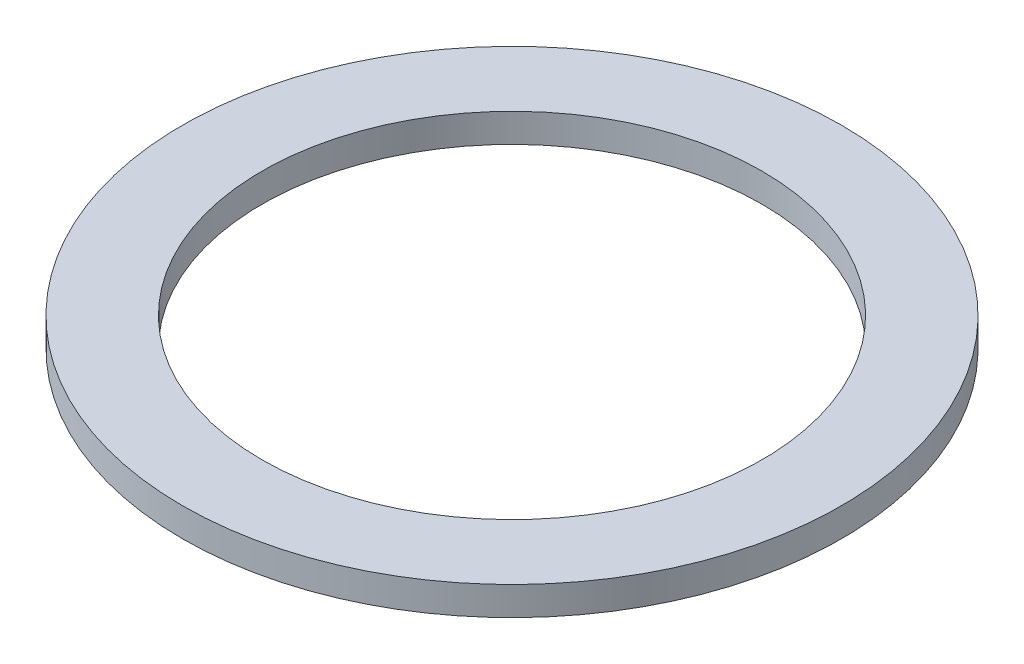
ISO-10303-21;
HEADER;
FILE_DESCRIPTION(('STEP AP214'),'2;1');
FILE_NAME('part.step','',(''),(''),'','','');
FILE_SCHEMA(('AUTOMOTIVE_DESIGN { 1 0 10303 214 1 1 1 1 }'));
ENDSEC;
DATA;
#1=APPLICATION_CONTEXT('core data for automotive mechanical design processes');
#2=APPLICATION_PROTOCOL_DEFINITION('international standard','automotive_design',2000,#1);
#3=PRODUCT_CONTEXT('',#1,'mechanical');
#4=PRODUCT('Part','Part','',(#3));
#5=PRODUCT_RELATED_PRODUCT_CATEGORY('part','',(#4));
#6=PRODUCT_DEFINITION_FORMATION('','',#4);
#7=PRODUCT_DEFINITION_CONTEXT('part definition',#1,'design');
#8=PRODUCT_DEFINITION('design','',#6,#7);
#9=PRODUCT_DEFINITION_SHAPE('','',#8);
#10=(LENGTH_UNIT() NAMED_UNIT(*) SI_UNIT(.MILLI.,.METRE.));
#11=(NAMED_UNIT(*) PLANE_ANGLE_UNIT() SI_UNIT($,.RADIAN.));
#12=(NAMED_UNIT(*) SI_UNIT($,.STERADIAN.) SOLID_ANGLE_UNIT());
#13=UNCERTAINTY_MEASURE_WITH_UNIT(LENGTH_MEASURE(1.E-05),#10,'distance_accuracy_value','');
#14=(GEOMETRIC_REPRESENTATION_CONTEXT(3) GLOBAL_UNCERTAINTY_ASSIGNED_CONTEXT((#13)) GLOBAL_UNIT_ASSIGNED_CONTEXT((#10,
#11,#12)) REPRESENTATION_CONTEXT('',''));
#15=CARTESIAN_POINT('',(0.,0.,0.));
#16=DIRECTION('',(0.,0.,1.));
#17=DIRECTION('',(1.,0.,0.));
#18=AXIS2_PLACEMENT_3D('',#15,#16,#17);
#19=CARTESIAN_POINT('',(0.,2.1,0.));
#20=DIRECTION('',(0.,1.,0.));
#21=DIRECTION('',(0.,0.,1.));
#22=AXIS2_PLACEMENT_3D('',#19,#20,#21);
#23=PLANE('',#22);
#24=CARTESIAN_POINT('',(0.,2.1,0.));
#25=DIRECTION('',(0.,1.,0.));
#26=DIRECTION('',(0.,0.,1.));
#27=AXIS2_PLACEMENT_3D('',#24,#25,#26);
#28=CIRCLE('',#27,24.12);
#29=CARTESIAN_POINT('',(0.,2.1,24.12));
#30=VERTEX_POINT('',#29);
#31=EDGE_CURVE('E10',#30,#30,#28,.T.);
#32=ORIENTED_EDGE('',*,*,#31,.T.);
#33=EDGE_LOOP('',(#32));
#34=FACE_BOUND('',#33,.T.);
#35=CARTESIAN_POINT('',(0.,2.1,0.));
#36=DIRECTION('',(0.,1.,0.));
#37=DIRECTION('',(0.,0.,1.));
#38=AXIS2_PLACEMENT_3D('',#35,#36,#37);
#39=CIRCLE('',#38,18.3);
#40=CARTESIAN_POINT('',(0.,2.1,18.3));
#41=VERTEX_POINT('',#40);
#42=EDGE_CURVE('E40',#41,#41,#39,.T.);
#43=ORIENTED_EDGE('',*,*,#42,.F.);
#44=EDGE_LOOP('',(#43));
#45=FACE_BOUND('',#44,.T.);
#46=ADVANCED_FACE('F29',(#34,#45),#23,.T.);
#47=CARTESIAN_POINT('',(0.,0.,0.));
#48=DIRECTION('',(0.,1.,0.));
#49=DIRECTION('',(0.,0.,1.));
#50=AXIS2_PLACEMENT_3D('',#47,#48,#49);
#51=PLANE('',#50);
#52=CARTESIAN_POINT('',(0.,0.,0.));
#53=DIRECTION('',(0.,1.,0.));
#54=DIRECTION('',(0.,0.,1.));
#55=AXIS2_PLACEMENT_3D('',#52,#53,#54);
#56=CIRCLE('',#55,24.12);
#57=CARTESIAN_POINT('',(0.,0.,24.12));
#58=VERTEX_POINT('',#57);
#59=EDGE_CURVE('E33',#58,#58,#56,.T.);
#60=ORIENTED_EDGE('',*,*,#59,.F.);
#61=EDGE_LOOP('',(#60));
#62=FACE_BOUND('',#61,.T.);
#63=CARTESIAN_POINT('',(0.,0.,0.));
#64=DIRECTION('',(0.,1.,0.));
#65=DIRECTION('',(0.,0.,1.));
#66=AXIS2_PLACEMENT_3D('',#63,#64,#65);
#67=CIRCLE('',#66,18.3);
#68=CARTESIAN_POINT('',(0.,0.,18.3));
#69=VERTEX_POINT('',#68);
#70=EDGE_CURVE('E42',#69,#69,#67,.T.);
#71=ORIENTED_EDGE('',*,*,#70,.T.);
#72=EDGE_LOOP('',(#71));
#73=FACE_BOUND('',#72,.T.);
#74=ADVANCED_FACE('F52',(#62,#73),#51,.F.);
#75=CARTESIAN_POINT('',(0.,2.1,0.));
#76=DIRECTION('',(0.,-1.,0.));
#77=DIRECTION('',(0.,0.,-1.));
#78=AXIS2_PLACEMENT_3D('',#75,#76,#77);
#79=CYLINDRICAL_SURFACE('',#78,24.12);
#80=ORIENTED_EDGE('',*,*,#31,.F.);
#81=EDGE_LOOP('',(#80));
#82=FACE_BOUND('',#81,.T.);
#83=ORIENTED_EDGE('',*,*,#59,.T.);
#84=EDGE_LOOP('',(#83));
#85=FACE_BOUND('',#84,.T.);
#86=ADVANCED_FACE('F31',(#82,#85),#79,.T.);
#87=CARTESIAN_POINT('',(0.,2.1,0.));
#88=DIRECTION('',(0.,-1.,0.));
#89=DIRECTION('',(0.,0.,-1.));
#90=AXIS2_PLACEMENT_3D('',#87,#88,#89);
#91=CYLINDRICAL_SURFACE('',#90,18.3);
#92=ORIENTED_EDGE('',*,*,#42,.T.);
#93=EDGE_LOOP('',(#92));
#94=FACE_BOUND('',#93,.T.);
#95=ORIENTED_EDGE('',*,*,#70,.F.);
#96=EDGE_LOOP('',(#95));
#97=FACE_BOUND('',#96,.T.);
#98=ADVANCED_FACE('F48',(#94,#97),#91,.F.);
#99=CLOSED_SHELL('',(#46,#74,#86,#98));
#100=MANIFOLD_SOLID_BREP('B2',#99);
#101=ADVANCED_BREP_SHAPE_REPRESENTATION('',(#18,#100),#14);
#102=SHAPE_DEFINITION_REPRESENTATION(#9,#101);
ENDSEC;
END-ISO-10303-21;
